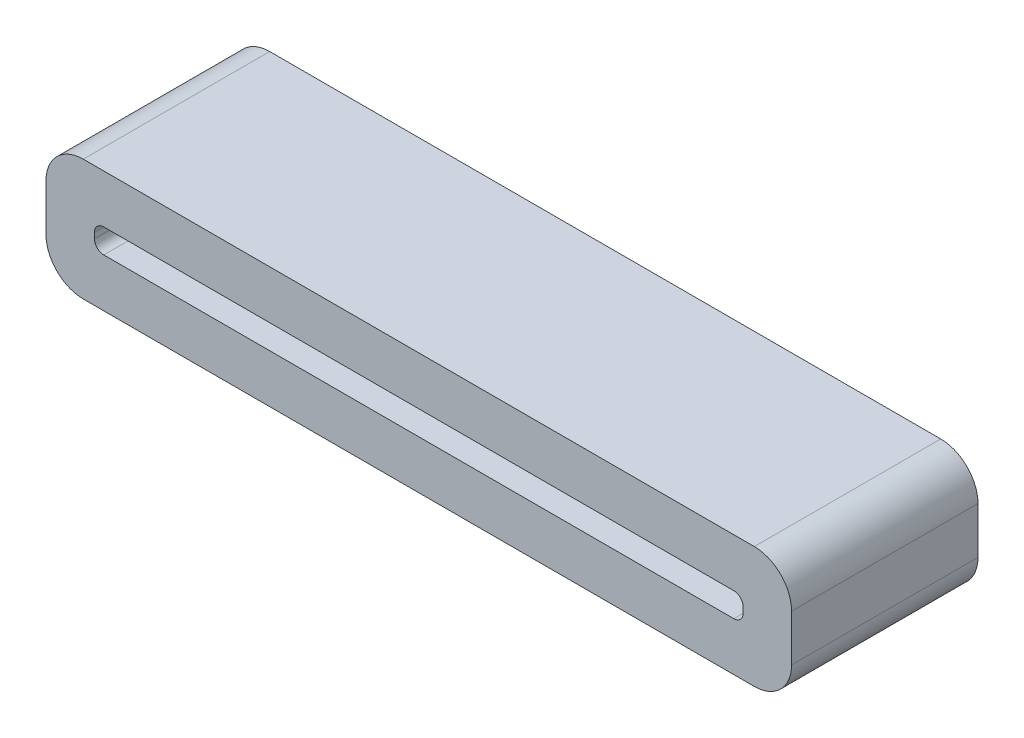
ISO-10303-21;
HEADER;
FILE_DESCRIPTION(('STEP AP214'),'2;1');
FILE_NAME('part.step','',(''),(''),'','','');
FILE_SCHEMA(('AUTOMOTIVE_DESIGN { 1 0 10303 214 1 1 1 1 }'));
ENDSEC;
DATA;
#1=APPLICATION_CONTEXT('core data for automotive mechanical design processes');
#2=APPLICATION_PROTOCOL_DEFINITION('international standard','automotive_design',2000,#1);
#3=PRODUCT_CONTEXT('',#1,'mechanical');
#4=PRODUCT('Part','Part','',(#3));
#5=PRODUCT_RELATED_PRODUCT_CATEGORY('part','',(#4));
#6=PRODUCT_DEFINITION_FORMATION('','',#4);
#7=PRODUCT_DEFINITION_CONTEXT('part definition',#1,'design');
#8=PRODUCT_DEFINITION('design','',#6,#7);
#9=PRODUCT_DEFINITION_SHAPE('','',#8);
#10=(LENGTH_UNIT() NAMED_UNIT(*) SI_UNIT(.MILLI.,.METRE.));
#11=(NAMED_UNIT(*) PLANE_ANGLE_UNIT() SI_UNIT($,.RADIAN.));
#12=(NAMED_UNIT(*) SI_UNIT($,.STERADIAN.) SOLID_ANGLE_UNIT());
#13=UNCERTAINTY_MEASURE_WITH_UNIT(LENGTH_MEASURE(1.E-05),#10,'distance_accuracy_value','');
#14=(GEOMETRIC_REPRESENTATION_CONTEXT(3) GLOBAL_UNCERTAINTY_ASSIGNED_CONTEXT((#13)) GLOBAL_UNIT_ASSIGNED_CONTEXT((#10,
#11,#12)) REPRESENTATION_CONTEXT('',''));
#15=CARTESIAN_POINT('',(0.,0.,0.));
#16=DIRECTION('',(0.,0.,1.));
#17=DIRECTION('',(1.,0.,0.));
#18=AXIS2_PLACEMENT_3D('',#15,#16,#17);
#19=CARTESIAN_POINT('',(6.41341516812368,7.69512614938623,-10.));
#20=DIRECTION('',(0.,0.,1.));
#21=DIRECTION('',(1.,0.,0.));
#22=AXIS2_PLACEMENT_3D('',#19,#20,#21);
#23=CYLINDRICAL_SURFACE('',#22,2.);
#24=CARTESIAN_POINT('',(6.41341516812368,7.69512614938623,0.));
#25=DIRECTION('',(0.,0.,1.));
#26=DIRECTION('',(1.,0.,0.));
#27=AXIS2_PLACEMENT_3D('',#24,#25,#26);
#28=CIRCLE('',#27,2.);
#29=CARTESIAN_POINT('',(8.41341516812368,7.69512614938623,0.));
#30=VERTEX_POINT('',#29);
#31=CARTESIAN_POINT('',(6.41341516812368,9.69512614938624,0.));
#32=VERTEX_POINT('',#31);
#33=EDGE_CURVE('E204',#30,#32,#28,.T.);
#34=ORIENTED_EDGE('',*,*,#33,.F.);
#35=DIRECTION('',(0.,0.,1.));
#36=VECTOR('',#35,1.);
#37=CARTESIAN_POINT('',(8.41341516812368,7.69512614938623,-10.));
#38=LINE('',#37,#36);
#39=CARTESIAN_POINT('',(8.41341516812368,7.69512614938623,-10.));
#40=VERTEX_POINT('',#39);
#41=EDGE_CURVE('E11',#40,#30,#38,.T.);
#42=ORIENTED_EDGE('',*,*,#41,.F.);
#43=CARTESIAN_POINT('',(6.41341516812368,7.69512614938623,-10.));
#44=DIRECTION('',(0.,0.,1.));
#45=DIRECTION('',(1.,0.,0.));
#46=AXIS2_PLACEMENT_3D('',#43,#44,#45);
#47=CIRCLE('',#46,2.);
#48=CARTESIAN_POINT('',(6.41341516812368,9.69512614938624,-10.));
#49=VERTEX_POINT('',#48);
#50=EDGE_CURVE('E238',#40,#49,#47,.T.);
#51=ORIENTED_EDGE('',*,*,#50,.T.);
#52=DIRECTION('',(0.,0.,1.));
#53=VECTOR('',#52,1.);
#54=CARTESIAN_POINT('',(6.41341516812368,9.69512614938624,-10.));
#55=LINE('',#54,#53);
#56=EDGE_CURVE('E35',#49,#32,#55,.T.);
#57=ORIENTED_EDGE('',*,*,#56,.T.);
#58=EDGE_LOOP('',(#34,#42,#51,#57));
#59=FACE_BOUND('',#58,.T.);
#60=ADVANCED_FACE('F32',(#59),#23,.T.);
#61=CARTESIAN_POINT('',(8.41341516812368,7.69512614938623,-10.));
#62=DIRECTION('',(1.,0.,0.));
#63=DIRECTION('',(0.,1.,0.));
#64=AXIS2_PLACEMENT_3D('',#61,#62,#63);
#65=PLANE('',#64);
#66=DIRECTION('',(0.,1.,0.));
#67=VECTOR('',#66,1.);
#68=CARTESIAN_POINT('',(8.41341516812368,7.69512614938623,0.));
#69=LINE('',#68,#67);
#70=CARTESIAN_POINT('',(8.41341516812368,5.19512614938624,0.));
#71=VERTEX_POINT('',#70);
#72=EDGE_CURVE('E235',#71,#30,#69,.T.);
#73=ORIENTED_EDGE('',*,*,#72,.F.);
#74=DIRECTION('',(0.,0.,1.));
#75=VECTOR('',#74,1.);
#76=CARTESIAN_POINT('',(8.41341516812368,5.19512614938624,-10.));
#77=LINE('',#76,#75);
#78=CARTESIAN_POINT('',(8.41341516812368,5.19512614938624,-10.));
#79=VERTEX_POINT('',#78);
#80=EDGE_CURVE('E40',#79,#71,#77,.T.);
#81=ORIENTED_EDGE('',*,*,#80,.F.);
#82=DIRECTION('',(0.,1.,0.));
#83=VECTOR('',#82,1.);
#84=CARTESIAN_POINT('',(8.41341516812368,7.69512614938623,-10.));
#85=LINE('',#84,#83);
#86=EDGE_CURVE('E259',#79,#40,#85,.T.);
#87=ORIENTED_EDGE('',*,*,#86,.T.);
#88=ORIENTED_EDGE('',*,*,#41,.T.);
#89=EDGE_LOOP('',(#73,#81,#87,#88));
#90=FACE_BOUND('',#89,.T.);
#91=ADVANCED_FACE('F282',(#90),#65,.T.);
#92=CARTESIAN_POINT('',(6.41341516812367,5.19512614938624,-10.));
#93=DIRECTION('',(0.,0.,1.));
#94=DIRECTION('',(1.,0.,0.));
#95=AXIS2_PLACEMENT_3D('',#92,#93,#94);
#96=CYLINDRICAL_SURFACE('',#95,2.);
#97=CARTESIAN_POINT('',(6.41341516812367,5.19512614938624,0.));
#98=DIRECTION('',(0.,0.,1.));
#99=DIRECTION('',(1.,0.,0.));
#100=AXIS2_PLACEMENT_3D('',#97,#98,#99);
#101=CIRCLE('',#100,2.);
#102=CARTESIAN_POINT('',(6.41341516812367,3.19512614938623,0.));
#103=VERTEX_POINT('',#102);
#104=EDGE_CURVE('E232',#103,#71,#101,.T.);
#105=ORIENTED_EDGE('',*,*,#104,.F.);
#106=DIRECTION('',(0.,0.,1.));
#107=VECTOR('',#106,1.);
#108=CARTESIAN_POINT('',(6.41341516812367,3.19512614938623,-10.));
#109=LINE('',#108,#107);
#110=CARTESIAN_POINT('',(6.41341516812367,3.19512614938623,-10.));
#111=VERTEX_POINT('',#110);
#112=EDGE_CURVE('E263',#111,#103,#109,.T.);
#113=ORIENTED_EDGE('',*,*,#112,.F.);
#114=CARTESIAN_POINT('',(6.41341516812367,5.19512614938624,-10.));
#115=DIRECTION('',(0.,0.,1.));
#116=DIRECTION('',(1.,0.,0.));
#117=AXIS2_PLACEMENT_3D('',#114,#115,#116);
#118=CIRCLE('',#117,2.);
#119=EDGE_CURVE('E256',#111,#79,#118,.T.);
#120=ORIENTED_EDGE('',*,*,#119,.T.);
#121=ORIENTED_EDGE('',*,*,#80,.T.);
#122=EDGE_LOOP('',(#105,#113,#120,#121));
#123=FACE_BOUND('',#122,.T.);
#124=ADVANCED_FACE('F303',(#123),#96,.T.);
#125=CARTESIAN_POINT('',(-29.5865848318763,3.19512614938624,-10.));
#126=DIRECTION('',(0.,-1.,0.));
#127=DIRECTION('',(1.,0.,0.));
#128=AXIS2_PLACEMENT_3D('',#125,#126,#127);
#129=PLANE('',#128);
#130=DIRECTION('',(1.,0.,0.));
#131=VECTOR('',#130,1.);
#132=CARTESIAN_POINT('',(-29.5865848318763,3.19512614938624,0.));
#133=LINE('',#132,#131);
#134=CARTESIAN_POINT('',(-29.5865848318763,3.19512614938624,0.));
#135=VERTEX_POINT('',#134);
#136=EDGE_CURVE('E229',#135,#103,#133,.T.);
#137=ORIENTED_EDGE('',*,*,#136,.F.);
#138=DIRECTION('',(0.,0.,1.));
#139=VECTOR('',#138,1.);
#140=CARTESIAN_POINT('',(-29.5865848318763,3.19512614938624,-10.));
#141=LINE('',#140,#139);
#142=CARTESIAN_POINT('',(-29.5865848318763,3.19512614938624,-10.));
#143=VERTEX_POINT('',#142);
#144=EDGE_CURVE('E265',#143,#135,#141,.T.);
#145=ORIENTED_EDGE('',*,*,#144,.F.);
#146=DIRECTION('',(1.,0.,0.));
#147=VECTOR('',#146,1.);
#148=CARTESIAN_POINT('',(-29.5865848318763,3.19512614938624,-10.));
#149=LINE('',#148,#147);
#150=EDGE_CURVE('E253',#143,#111,#149,.T.);
#151=ORIENTED_EDGE('',*,*,#150,.T.);
#152=ORIENTED_EDGE('',*,*,#112,.T.);
#153=EDGE_LOOP('',(#137,#145,#151,#152));
#154=FACE_BOUND('',#153,.T.);
#155=ADVANCED_FACE('F301',(#154),#129,.T.);
#156=CARTESIAN_POINT('',(-29.5865848318763,5.19512614938624,-10.));
#157=DIRECTION('',(0.,0.,1.));
#158=DIRECTION('',(1.,0.,0.));
#159=AXIS2_PLACEMENT_3D('',#156,#157,#158);
#160=CYLINDRICAL_SURFACE('',#159,2.);
#161=CARTESIAN_POINT('',(-29.5865848318763,5.19512614938624,0.));
#162=DIRECTION('',(0.,0.,1.));
#163=DIRECTION('',(-1.,0.,0.));
#164=AXIS2_PLACEMENT_3D('',#161,#162,#163);
#165=CIRCLE('',#164,2.);
#166=CARTESIAN_POINT('',(-31.5865848318763,5.19512614938624,0.));
#167=VERTEX_POINT('',#166);
#168=EDGE_CURVE('E226',#167,#135,#165,.T.);
#169=ORIENTED_EDGE('',*,*,#168,.F.);
#170=DIRECTION('',(0.,0.,1.));
#171=VECTOR('',#170,1.);
#172=CARTESIAN_POINT('',(-31.5865848318763,5.19512614938624,-10.));
#173=LINE('',#172,#171);
#174=CARTESIAN_POINT('',(-31.5865848318763,5.19512614938624,-10.));
#175=VERTEX_POINT('',#174);
#176=EDGE_CURVE('E267',#175,#167,#173,.T.);
#177=ORIENTED_EDGE('',*,*,#176,.F.);
#178=CARTESIAN_POINT('',(-29.5865848318763,5.19512614938624,-10.));
#179=DIRECTION('',(0.,0.,1.));
#180=DIRECTION('',(-1.,0.,0.));
#181=AXIS2_PLACEMENT_3D('',#178,#179,#180);
#182=CIRCLE('',#181,2.);
#183=EDGE_CURVE('E250',#175,#143,#182,.T.);
#184=ORIENTED_EDGE('',*,*,#183,.T.);
#185=ORIENTED_EDGE('',*,*,#144,.T.);
#186=EDGE_LOOP('',(#169,#177,#184,#185));
#187=FACE_BOUND('',#186,.T.);
#188=ADVANCED_FACE('F297',(#187),#160,.T.);
#189=CARTESIAN_POINT('',(-31.5865848318763,7.69512614938623,-10.));
#190=DIRECTION('',(-1.,0.,0.));
#191=DIRECTION('',(0.,-1.,0.));
#192=AXIS2_PLACEMENT_3D('',#189,#190,#191);
#193=PLANE('',#192);
#194=DIRECTION('',(0.,-1.,0.));
#195=VECTOR('',#194,1.);
#196=CARTESIAN_POINT('',(-31.5865848318763,7.69512614938623,0.));
#197=LINE('',#196,#195);
#198=CARTESIAN_POINT('',(-31.5865848318763,7.69512614938623,0.));
#199=VERTEX_POINT('',#198);
#200=EDGE_CURVE('E223',#199,#167,#197,.T.);
#201=ORIENTED_EDGE('',*,*,#200,.F.);
#202=DIRECTION('',(0.,0.,1.));
#203=VECTOR('',#202,1.);
#204=CARTESIAN_POINT('',(-31.5865848318763,7.69512614938623,-10.));
#205=LINE('',#204,#203);
#206=CARTESIAN_POINT('',(-31.5865848318763,7.69512614938623,-10.));
#207=VERTEX_POINT('',#206);
#208=EDGE_CURVE('E269',#207,#199,#205,.T.);
#209=ORIENTED_EDGE('',*,*,#208,.F.);
#210=DIRECTION('',(0.,-1.,0.));
#211=VECTOR('',#210,1.);
#212=CARTESIAN_POINT('',(-31.5865848318763,7.69512614938623,-10.));
#213=LINE('',#212,#211);
#214=EDGE_CURVE('E247',#207,#175,#213,.T.);
#215=ORIENTED_EDGE('',*,*,#214,.T.);
#216=ORIENTED_EDGE('',*,*,#176,.T.);
#217=EDGE_LOOP('',(#201,#209,#215,#216));
#218=FACE_BOUND('',#217,.T.);
#219=ADVANCED_FACE('F295',(#218),#193,.T.);
#220=CARTESIAN_POINT('',(-29.5865848318763,7.69512614938623,-10.));
#221=DIRECTION('',(0.,0.,1.));
#222=DIRECTION('',(1.,0.,0.));
#223=AXIS2_PLACEMENT_3D('',#220,#221,#222);
#224=CYLINDRICAL_SURFACE('',#223,2.);
#225=CARTESIAN_POINT('',(-29.5865848318763,7.69512614938623,0.));
#226=DIRECTION('',(0.,0.,1.));
#227=DIRECTION('',(-1.,0.,0.));
#228=AXIS2_PLACEMENT_3D('',#225,#226,#227);
#229=CIRCLE('',#228,2.);
#230=CARTESIAN_POINT('',(-29.5865848318763,9.69512614938624,0.));
#231=VERTEX_POINT('',#230);
#232=EDGE_CURVE('E220',#231,#199,#229,.T.);
#233=ORIENTED_EDGE('',*,*,#232,.F.);
#234=DIRECTION('',(0.,0.,1.));
#235=VECTOR('',#234,1.);
#236=CARTESIAN_POINT('',(-29.5865848318763,9.69512614938624,-10.));
#237=LINE('',#236,#235);
#238=CARTESIAN_POINT('',(-29.5865848318763,9.69512614938624,-10.));
#239=VERTEX_POINT('',#238);
#240=EDGE_CURVE('E270',#239,#231,#237,.T.);
#241=ORIENTED_EDGE('',*,*,#240,.F.);
#242=CARTESIAN_POINT('',(-29.5865848318763,7.69512614938623,-10.));
#243=DIRECTION('',(0.,0.,1.));
#244=DIRECTION('',(-1.,0.,0.));
#245=AXIS2_PLACEMENT_3D('',#242,#243,#244);
#246=CIRCLE('',#245,2.);
#247=EDGE_CURVE('E244',#239,#207,#246,.T.);
#248=ORIENTED_EDGE('',*,*,#247,.T.);
#249=ORIENTED_EDGE('',*,*,#208,.T.);
#250=EDGE_LOOP('',(#233,#241,#248,#249));
#251=FACE_BOUND('',#250,.T.);
#252=ADVANCED_FACE('F291',(#251),#224,.T.);
#253=CARTESIAN_POINT('',(-29.5865848318763,9.69512614938624,-10.));
#254=DIRECTION('',(0.,1.,0.));
#255=DIRECTION('',(0.,0.,1.));
#256=AXIS2_PLACEMENT_3D('',#253,#254,#255);
#257=PLANE('',#256);
#258=DIRECTION('',(-1.,0.,0.));
#259=VECTOR('',#258,1.);
#260=CARTESIAN_POINT('',(-29.5865848318763,9.69512614938624,0.));
#261=LINE('',#260,#259);
#262=EDGE_CURVE('E217',#32,#231,#261,.T.);
#263=ORIENTED_EDGE('',*,*,#262,.F.);
#264=ORIENTED_EDGE('',*,*,#56,.F.);
#265=DIRECTION('',(-1.,0.,0.));
#266=VECTOR('',#265,1.);
#267=CARTESIAN_POINT('',(-29.5865848318763,9.69512614938624,-10.));
#268=LINE('',#267,#266);
#269=EDGE_CURVE('E241',#49,#239,#268,.T.);
#270=ORIENTED_EDGE('',*,*,#269,.T.);
#271=ORIENTED_EDGE('',*,*,#240,.T.);
#272=EDGE_LOOP('',(#263,#264,#270,#271));
#273=FACE_BOUND('',#272,.T.);
#274=ADVANCED_FACE('F278',(#273),#257,.T.);
#275=CARTESIAN_POINT('',(6.41341516812368,7.69512614938623,-10.));
#276=DIRECTION('',(0.,0.,1.));
#277=DIRECTION('',(1.,0.,0.));
#278=AXIS2_PLACEMENT_3D('',#275,#276,#277);
#279=PLANE('',#278);
#280=DIRECTION('',(-1.,0.,0.));
#281=VECTOR('',#280,1.);
#282=CARTESIAN_POINT('',(-28.4865848318763,7.09512614938624,-10.));
#283=LINE('',#282,#281);
#284=CARTESIAN_POINT('',(5.31341516812368,7.09512614938623,-10.));
#285=VERTEX_POINT('',#284);
#286=CARTESIAN_POINT('',(-28.4865848318763,7.09512614938624,-10.));
#287=VERTEX_POINT('',#286);
#288=EDGE_CURVE('E199',#285,#287,#283,.T.);
#289=ORIENTED_EDGE('',*,*,#288,.T.);
#290=CARTESIAN_POINT('',(-28.4865848318763,6.59512614938624,-10.));
#291=DIRECTION('',(0.,0.,1.));
#292=DIRECTION('',(-1.,0.,0.));
#293=AXIS2_PLACEMENT_3D('',#290,#291,#292);
#294=CIRCLE('',#293,0.500000000000002);
#295=CARTESIAN_POINT('',(-28.9865848318763,6.59512614938624,-10.));
#296=VERTEX_POINT('',#295);
#297=EDGE_CURVE('E181',#287,#296,#294,.T.);
#298=ORIENTED_EDGE('',*,*,#297,.T.);
#299=DIRECTION('',(0.,-1.,0.));
#300=VECTOR('',#299,1.);
#301=CARTESIAN_POINT('',(-28.9865848318763,6.59512614938624,-10.));
#302=LINE('',#301,#300);
#303=CARTESIAN_POINT('',(-28.9865848318763,6.29512614938624,-10.));
#304=VERTEX_POINT('',#303);
#305=EDGE_CURVE('E184',#296,#304,#302,.T.);
#306=ORIENTED_EDGE('',*,*,#305,.T.);
#307=CARTESIAN_POINT('',(-28.4865848318763,6.29512614938624,-10.));
#308=DIRECTION('',(0.,0.,1.));
#309=DIRECTION('',(1.,0.,0.));
#310=AXIS2_PLACEMENT_3D('',#307,#308,#309);
#311=CIRCLE('',#310,0.500000000000002);
#312=CARTESIAN_POINT('',(-28.4865848318763,5.79512614938623,-10.));
#313=VERTEX_POINT('',#312);
#314=EDGE_CURVE('E48',#304,#313,#311,.T.);
#315=ORIENTED_EDGE('',*,*,#314,.T.);
#316=DIRECTION('',(1.,0.,0.));
#317=VECTOR('',#316,1.);
#318=CARTESIAN_POINT('',(-28.4865848318763,5.79512614938624,-10.));
#319=LINE('',#318,#317);
#320=CARTESIAN_POINT('',(5.31341516812368,5.79512614938624,-10.));
#321=VERTEX_POINT('',#320);
#322=EDGE_CURVE('E187',#313,#321,#319,.T.);
#323=ORIENTED_EDGE('',*,*,#322,.T.);
#324=CARTESIAN_POINT('',(5.31341516812368,6.29512614938624,-10.));
#325=DIRECTION('',(0.,0.,1.));
#326=DIRECTION('',(1.,0.,0.));
#327=AXIS2_PLACEMENT_3D('',#324,#325,#326);
#328=CIRCLE('',#327,0.5);
#329=CARTESIAN_POINT('',(5.81341516812368,6.29512614938624,-10.));
#330=VERTEX_POINT('',#329);
#331=EDGE_CURVE('E190',#321,#330,#328,.T.);
#332=ORIENTED_EDGE('',*,*,#331,.T.);
#333=DIRECTION('',(0.,1.,0.));
#334=VECTOR('',#333,1.);
#335=CARTESIAN_POINT('',(5.81341516812368,6.59512614938624,-10.));
#336=LINE('',#335,#334);
#337=CARTESIAN_POINT('',(5.81341516812368,6.59512614938624,-10.));
#338=VERTEX_POINT('',#337);
#339=EDGE_CURVE('E193',#330,#338,#336,.T.);
#340=ORIENTED_EDGE('',*,*,#339,.T.);
#341=CARTESIAN_POINT('',(5.31341516812368,6.59512614938624,-10.));
#342=DIRECTION('',(0.,0.,1.));
#343=DIRECTION('',(1.,0.,0.));
#344=AXIS2_PLACEMENT_3D('',#341,#342,#343);
#345=CIRCLE('',#344,0.499999999999998);
#346=EDGE_CURVE('E196',#338,#285,#345,.T.);
#347=ORIENTED_EDGE('',*,*,#346,.T.);
#348=EDGE_LOOP('',(#289,#298,#306,#315,#323,#332,#340,#347));
#349=FACE_BOUND('',#348,.T.);
#350=ORIENTED_EDGE('',*,*,#50,.F.);
#351=ORIENTED_EDGE('',*,*,#86,.F.);
#352=ORIENTED_EDGE('',*,*,#119,.F.);
#353=ORIENTED_EDGE('',*,*,#150,.F.);
#354=ORIENTED_EDGE('',*,*,#183,.F.);
#355=ORIENTED_EDGE('',*,*,#214,.F.);
#356=ORIENTED_EDGE('',*,*,#247,.F.);
#357=ORIENTED_EDGE('',*,*,#269,.F.);
#358=EDGE_LOOP('',(#350,#351,#352,#353,#354,#355,#356,#357));
#359=FACE_BOUND('',#358,.T.);
#360=ADVANCED_FACE('F285',(#349,#359),#279,.F.);
#361=CARTESIAN_POINT('',(6.41341516812368,7.69512614938623,0.));
#362=DIRECTION('',(0.,0.,1.));
#363=DIRECTION('',(1.,0.,0.));
#364=AXIS2_PLACEMENT_3D('',#361,#362,#363);
#365=PLANE('',#364);
#366=CARTESIAN_POINT('',(-28.4865848318763,6.59512614938624,0.));
#367=DIRECTION('',(0.,0.,1.));
#368=DIRECTION('',(-1.,0.,0.));
#369=AXIS2_PLACEMENT_3D('',#366,#367,#368);
#370=CIRCLE('',#369,0.500000000000002);
#371=CARTESIAN_POINT('',(-28.4865848318763,7.09512614938624,0.));
#372=VERTEX_POINT('',#371);
#373=CARTESIAN_POINT('',(-28.9865848318763,6.59512614938624,0.));
#374=VERTEX_POINT('',#373);
#375=EDGE_CURVE('E56',#372,#374,#370,.T.);
#376=ORIENTED_EDGE('',*,*,#375,.F.);
#377=DIRECTION('',(-1.,0.,0.));
#378=VECTOR('',#377,1.);
#379=CARTESIAN_POINT('',(-28.4865848318763,7.09512614938624,0.));
#380=LINE('',#379,#378);
#381=CARTESIAN_POINT('',(5.31341516812368,7.09512614938623,0.));
#382=VERTEX_POINT('',#381);
#383=EDGE_CURVE('E178',#382,#372,#380,.T.);
#384=ORIENTED_EDGE('',*,*,#383,.F.);
#385=CARTESIAN_POINT('',(5.31341516812368,6.59512614938624,0.));
#386=DIRECTION('',(0.,0.,1.));
#387=DIRECTION('',(1.,0.,0.));
#388=AXIS2_PLACEMENT_3D('',#385,#386,#387);
#389=CIRCLE('',#388,0.499999999999998);
#390=CARTESIAN_POINT('',(5.81341516812368,6.59512614938624,0.));
#391=VERTEX_POINT('',#390);
#392=EDGE_CURVE('E175',#391,#382,#389,.T.);
#393=ORIENTED_EDGE('',*,*,#392,.F.);
#394=DIRECTION('',(0.,1.,0.));
#395=VECTOR('',#394,1.);
#396=CARTESIAN_POINT('',(5.81341516812368,6.59512614938624,0.));
#397=LINE('',#396,#395);
#398=CARTESIAN_POINT('',(5.81341516812368,6.29512614938624,0.));
#399=VERTEX_POINT('',#398);
#400=EDGE_CURVE('E172',#399,#391,#397,.T.);
#401=ORIENTED_EDGE('',*,*,#400,.F.);
#402=CARTESIAN_POINT('',(5.31341516812368,6.29512614938624,0.));
#403=DIRECTION('',(0.,0.,1.));
#404=DIRECTION('',(1.,0.,0.));
#405=AXIS2_PLACEMENT_3D('',#402,#403,#404);
#406=CIRCLE('',#405,0.5);
#407=CARTESIAN_POINT('',(5.31341516812368,5.79512614938624,0.));
#408=VERTEX_POINT('',#407);
#409=EDGE_CURVE('E166',#408,#399,#406,.T.);
#410=ORIENTED_EDGE('',*,*,#409,.F.);
#411=DIRECTION('',(1.,0.,0.));
#412=VECTOR('',#411,1.);
#413=CARTESIAN_POINT('',(-28.4865848318763,5.79512614938624,0.));
#414=LINE('',#413,#412);
#415=CARTESIAN_POINT('',(-28.4865848318763,5.79512614938623,0.));
#416=VERTEX_POINT('',#415);
#417=EDGE_CURVE('E164',#416,#408,#414,.T.);
#418=ORIENTED_EDGE('',*,*,#417,.F.);
#419=CARTESIAN_POINT('',(-28.4865848318763,6.29512614938624,0.));
#420=DIRECTION('',(0.,0.,1.));
#421=DIRECTION('',(1.,0.,0.));
#422=AXIS2_PLACEMENT_3D('',#419,#420,#421);
#423=CIRCLE('',#422,0.500000000000002);
#424=CARTESIAN_POINT('',(-28.9865848318763,6.29512614938624,0.));
#425=VERTEX_POINT('',#424);
#426=EDGE_CURVE('E147',#425,#416,#423,.T.);
#427=ORIENTED_EDGE('',*,*,#426,.F.);
#428=DIRECTION('',(0.,-1.,0.));
#429=VECTOR('',#428,1.);
#430=CARTESIAN_POINT('',(-28.9865848318763,6.59512614938624,0.));
#431=LINE('',#430,#429);
#432=EDGE_CURVE('E156',#374,#425,#431,.T.);
#433=ORIENTED_EDGE('',*,*,#432,.F.);
#434=EDGE_LOOP('',(#376,#384,#393,#401,#410,#418,#427,#433));
#435=FACE_BOUND('',#434,.T.);
#436=ORIENTED_EDGE('',*,*,#33,.T.);
#437=ORIENTED_EDGE('',*,*,#262,.T.);
#438=ORIENTED_EDGE('',*,*,#232,.T.);
#439=ORIENTED_EDGE('',*,*,#200,.T.);
#440=ORIENTED_EDGE('',*,*,#168,.T.);
#441=ORIENTED_EDGE('',*,*,#136,.T.);
#442=ORIENTED_EDGE('',*,*,#104,.T.);
#443=ORIENTED_EDGE('',*,*,#72,.T.);
#444=EDGE_LOOP('',(#436,#437,#438,#439,#440,#441,#442,#443));
#445=FACE_BOUND('',#444,.T.);
#446=ADVANCED_FACE('F160',(#435,#445),#365,.T.);
#447=CARTESIAN_POINT('',(-28.4865848318763,6.59512614938624,-10.));
#448=DIRECTION('',(0.,0.,1.));
#449=DIRECTION('',(1.,0.,0.));
#450=AXIS2_PLACEMENT_3D('',#447,#448,#449);
#451=CYLINDRICAL_SURFACE('',#450,0.500000000000002);
#452=ORIENTED_EDGE('',*,*,#375,.T.);
#453=DIRECTION('',(0.,0.,1.));
#454=VECTOR('',#453,1.);
#455=CARTESIAN_POINT('',(-28.9865848318763,6.59512614938624,-10.));
#456=LINE('',#455,#454);
#457=EDGE_CURVE('E153',#296,#374,#456,.T.);
#458=ORIENTED_EDGE('',*,*,#457,.F.);
#459=ORIENTED_EDGE('',*,*,#297,.F.);
#460=DIRECTION('',(0.,0.,1.));
#461=VECTOR('',#460,1.);
#462=CARTESIAN_POINT('',(-28.4865848318763,7.09512614938624,-10.));
#463=LINE('',#462,#461);
#464=EDGE_CURVE('E202',#287,#372,#463,.T.);
#465=ORIENTED_EDGE('',*,*,#464,.T.);
#466=EDGE_LOOP('',(#452,#458,#459,#465));
#467=FACE_BOUND('',#466,.T.);
#468=ADVANCED_FACE('F378',(#467),#451,.F.);
#469=CARTESIAN_POINT('',(-28.4865848318763,7.09512614938624,-10.));
#470=DIRECTION('',(0.,1.,0.));
#471=DIRECTION('',(0.,0.,1.));
#472=AXIS2_PLACEMENT_3D('',#469,#470,#471);
#473=PLANE('',#472);
#474=ORIENTED_EDGE('',*,*,#383,.T.);
#475=ORIENTED_EDGE('',*,*,#464,.F.);
#476=ORIENTED_EDGE('',*,*,#288,.F.);
#477=DIRECTION('',(0.,0.,1.));
#478=VECTOR('',#477,1.);
#479=CARTESIAN_POINT('',(5.31341516812368,7.09512614938623,-10.));
#480=LINE('',#479,#478);
#481=EDGE_CURVE('E205',#285,#382,#480,.T.);
#482=ORIENTED_EDGE('',*,*,#481,.T.);
#483=EDGE_LOOP('',(#474,#475,#476,#482));
#484=FACE_BOUND('',#483,.T.);
#485=ADVANCED_FACE('F387',(#484),#473,.F.);
#486=CARTESIAN_POINT('',(5.31341516812368,6.59512614938624,-10.));
#487=DIRECTION('',(0.,0.,1.));
#488=DIRECTION('',(1.,0.,0.));
#489=AXIS2_PLACEMENT_3D('',#486,#487,#488);
#490=CYLINDRICAL_SURFACE('',#489,0.499999999999998);
#491=ORIENTED_EDGE('',*,*,#392,.T.);
#492=ORIENTED_EDGE('',*,*,#481,.F.);
#493=ORIENTED_EDGE('',*,*,#346,.F.);
#494=DIRECTION('',(0.,0.,1.));
#495=VECTOR('',#494,1.);
#496=CARTESIAN_POINT('',(5.81341516812368,6.59512614938624,-10.));
#497=LINE('',#496,#495);
#498=EDGE_CURVE('E207',#338,#391,#497,.T.);
#499=ORIENTED_EDGE('',*,*,#498,.T.);
#500=EDGE_LOOP('',(#491,#492,#493,#499));
#501=FACE_BOUND('',#500,.T.);
#502=ADVANCED_FACE('F396',(#501),#490,.F.);
#503=CARTESIAN_POINT('',(5.81341516812368,6.59512614938624,-10.));
#504=DIRECTION('',(1.,0.,0.));
#505=DIRECTION('',(0.,0.,-1.));
#506=AXIS2_PLACEMENT_3D('',#503,#504,#505);
#507=PLANE('',#506);
#508=ORIENTED_EDGE('',*,*,#400,.T.);
#509=ORIENTED_EDGE('',*,*,#498,.F.);
#510=ORIENTED_EDGE('',*,*,#339,.F.);
#511=DIRECTION('',(0.,0.,1.));
#512=VECTOR('',#511,1.);
#513=CARTESIAN_POINT('',(5.81341516812368,6.29512614938624,-10.));
#514=LINE('',#513,#512);
#515=EDGE_CURVE('E209',#330,#399,#514,.T.);
#516=ORIENTED_EDGE('',*,*,#515,.T.);
#517=EDGE_LOOP('',(#508,#509,#510,#516));
#518=FACE_BOUND('',#517,.T.);
#519=ADVANCED_FACE('F406',(#518),#507,.F.);
#520=CARTESIAN_POINT('',(5.31341516812368,6.29512614938624,-10.));
#521=DIRECTION('',(0.,0.,1.));
#522=DIRECTION('',(1.,0.,0.));
#523=AXIS2_PLACEMENT_3D('',#520,#521,#522);
#524=CYLINDRICAL_SURFACE('',#523,0.5);
#525=ORIENTED_EDGE('',*,*,#409,.T.);
#526=ORIENTED_EDGE('',*,*,#515,.F.);
#527=ORIENTED_EDGE('',*,*,#331,.F.);
#528=DIRECTION('',(0.,0.,1.));
#529=VECTOR('',#528,1.);
#530=CARTESIAN_POINT('',(5.31341516812368,5.79512614938624,-10.));
#531=LINE('',#530,#529);
#532=EDGE_CURVE('E211',#321,#408,#531,.T.);
#533=ORIENTED_EDGE('',*,*,#532,.T.);
#534=EDGE_LOOP('',(#525,#526,#527,#533));
#535=FACE_BOUND('',#534,.T.);
#536=ADVANCED_FACE('F416',(#535),#524,.F.);
#537=CARTESIAN_POINT('',(-28.4865848318763,5.79512614938624,-10.));
#538=DIRECTION('',(0.,-1.,0.));
#539=DIRECTION('',(0.,0.,-1.));
#540=AXIS2_PLACEMENT_3D('',#537,#538,#539);
#541=PLANE('',#540);
#542=ORIENTED_EDGE('',*,*,#417,.T.);
#543=ORIENTED_EDGE('',*,*,#532,.F.);
#544=ORIENTED_EDGE('',*,*,#322,.F.);
#545=DIRECTION('',(0.,0.,1.));
#546=VECTOR('',#545,1.);
#547=CARTESIAN_POINT('',(-28.4865848318763,5.79512614938623,-10.));
#548=LINE('',#547,#546);
#549=EDGE_CURVE('E152',#313,#416,#548,.T.);
#550=ORIENTED_EDGE('',*,*,#549,.T.);
#551=EDGE_LOOP('',(#542,#543,#544,#550));
#552=FACE_BOUND('',#551,.T.);
#553=ADVANCED_FACE('F426',(#552),#541,.F.);
#554=CARTESIAN_POINT('',(-28.4865848318763,6.29512614938624,-10.));
#555=DIRECTION('',(0.,0.,1.));
#556=DIRECTION('',(1.,0.,0.));
#557=AXIS2_PLACEMENT_3D('',#554,#555,#556);
#558=CYLINDRICAL_SURFACE('',#557,0.500000000000002);
#559=ORIENTED_EDGE('',*,*,#426,.T.);
#560=ORIENTED_EDGE('',*,*,#549,.F.);
#561=ORIENTED_EDGE('',*,*,#314,.F.);
#562=DIRECTION('',(0.,0.,1.));
#563=VECTOR('',#562,1.);
#564=CARTESIAN_POINT('',(-28.9865848318763,6.29512614938624,-10.));
#565=LINE('',#564,#563);
#566=EDGE_CURVE('E143',#304,#425,#565,.T.);
#567=ORIENTED_EDGE('',*,*,#566,.T.);
#568=EDGE_LOOP('',(#559,#560,#561,#567));
#569=FACE_BOUND('',#568,.T.);
#570=ADVANCED_FACE('F145',(#569),#558,.F.);
#571=CARTESIAN_POINT('',(-28.9865848318763,6.59512614938624,-10.));
#572=DIRECTION('',(-1.,0.,0.));
#573=DIRECTION('',(0.,0.,1.));
#574=AXIS2_PLACEMENT_3D('',#571,#572,#573);
#575=PLANE('',#574);
#576=ORIENTED_EDGE('',*,*,#432,.T.);
#577=ORIENTED_EDGE('',*,*,#566,.F.);
#578=ORIENTED_EDGE('',*,*,#305,.F.);
#579=ORIENTED_EDGE('',*,*,#457,.T.);
#580=EDGE_LOOP('',(#576,#577,#578,#579));
#581=FACE_BOUND('',#580,.T.);
#582=ADVANCED_FACE('F157',(#581),#575,.F.);
#583=CLOSED_SHELL('',(#60,#91,#124,#155,#188,#219,#252,#274,#360,#446,#468,#485,#502,#519,#536,
#553,#570,#582));
#584=MANIFOLD_SOLID_BREP('B2',#583);
#585=ADVANCED_BREP_SHAPE_REPRESENTATION('',(#18,#584),#14);
#586=SHAPE_DEFINITION_REPRESENTATION(#9,#585);
ENDSEC;
END-ISO-10303-21;
